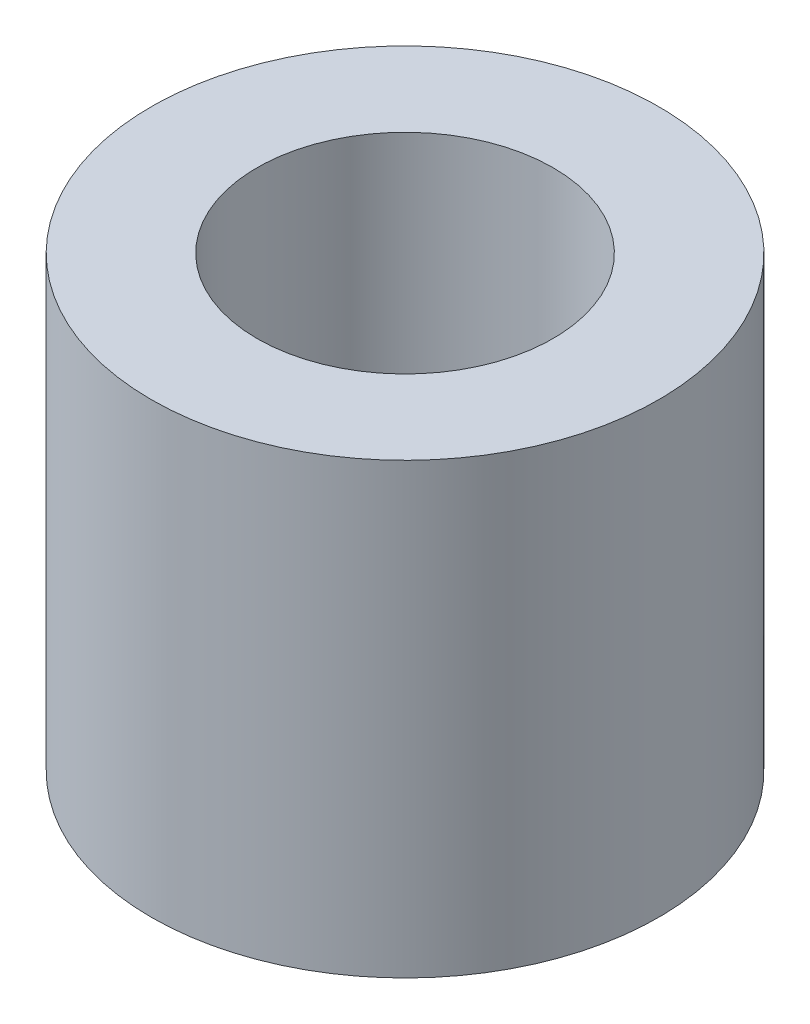
ISO-10303-21;
HEADER;
FILE_DESCRIPTION(('STEP AP214'),'2;1');
FILE_NAME('part.step','',(''),(''),'','','');
FILE_SCHEMA(('AUTOMOTIVE_DESIGN { 1 0 10303 214 1 1 1 1 }'));
ENDSEC;
DATA;
#1=APPLICATION_CONTEXT('core data for automotive mechanical design processes');
#2=APPLICATION_PROTOCOL_DEFINITION('international standard','automotive_design',2000,#1);
#3=PRODUCT_CONTEXT('',#1,'mechanical');
#4=PRODUCT('Part','Part','',(#3));
#5=PRODUCT_RELATED_PRODUCT_CATEGORY('part','',(#4));
#6=PRODUCT_DEFINITION_FORMATION('','',#4);
#7=PRODUCT_DEFINITION_CONTEXT('part definition',#1,'design');
#8=PRODUCT_DEFINITION('design','',#6,#7);
#9=PRODUCT_DEFINITION_SHAPE('','',#8);
#10=(LENGTH_UNIT() NAMED_UNIT(*) SI_UNIT(.MILLI.,.METRE.));
#11=(NAMED_UNIT(*) PLANE_ANGLE_UNIT() SI_UNIT($,.RADIAN.));
#12=(NAMED_UNIT(*) SI_UNIT($,.STERADIAN.) SOLID_ANGLE_UNIT());
#13=UNCERTAINTY_MEASURE_WITH_UNIT(LENGTH_MEASURE(1.E-05),#10,'distance_accuracy_value','');
#14=(GEOMETRIC_REPRESENTATION_CONTEXT(3) GLOBAL_UNCERTAINTY_ASSIGNED_CONTEXT((#13)) GLOBAL_UNIT_ASSIGNED_CONTEXT((#10,
#11,#12)) REPRESENTATION_CONTEXT('',''));
#15=CARTESIAN_POINT('',(0.,0.,0.));
#16=DIRECTION('',(0.,0.,1.));
#17=DIRECTION('',(1.,0.,0.));
#18=AXIS2_PLACEMENT_3D('',#15,#16,#17);
#19=CARTESIAN_POINT('',(0.,5.3,0.));
#20=DIRECTION('',(0.,1.,0.));
#21=DIRECTION('',(0.,0.,1.));
#22=AXIS2_PLACEMENT_3D('',#19,#20,#21);
#23=PLANE('',#22);
#24=CARTESIAN_POINT('',(0.,5.3,0.));
#25=DIRECTION('',(0.,1.,0.));
#26=DIRECTION('',(0.,0.,1.));
#27=AXIS2_PLACEMENT_3D('',#24,#25,#26);
#28=CIRCLE('',#27,3.);
#29=CARTESIAN_POINT('',(0.,5.3,3.));
#30=VERTEX_POINT('',#29);
#31=EDGE_CURVE('E10',#30,#30,#28,.T.);
#32=ORIENTED_EDGE('',*,*,#31,.T.);
#33=EDGE_LOOP('',(#32));
#34=FACE_BOUND('',#33,.T.);
#35=CARTESIAN_POINT('',(0.,5.3,0.));
#36=DIRECTION('',(0.,1.,0.));
#37=DIRECTION('',(0.,0.,1.));
#38=AXIS2_PLACEMENT_3D('',#35,#36,#37);
#39=CIRCLE('',#38,1.75);
#40=CARTESIAN_POINT('',(0.,5.3,1.75));
#41=VERTEX_POINT('',#40);
#42=EDGE_CURVE('E44',#41,#41,#39,.T.);
#43=ORIENTED_EDGE('',*,*,#42,.F.);
#44=EDGE_LOOP('',(#43));
#45=FACE_BOUND('',#44,.T.);
#46=ADVANCED_FACE('F33',(#34,#45),#23,.T.);
#47=CARTESIAN_POINT('',(0.,0.,0.));
#48=DIRECTION('',(0.,1.,0.));
#49=DIRECTION('',(0.,0.,1.));
#50=AXIS2_PLACEMENT_3D('',#47,#48,#49);
#51=PLANE('',#50);
#52=CARTESIAN_POINT('',(0.,0.,0.));
#53=DIRECTION('',(0.,1.,0.));
#54=DIRECTION('',(0.,0.,1.));
#55=AXIS2_PLACEMENT_3D('',#52,#53,#54);
#56=CIRCLE('',#55,3.);
#57=CARTESIAN_POINT('',(0.,0.,3.));
#58=VERTEX_POINT('',#57);
#59=EDGE_CURVE('E37',#58,#58,#56,.T.);
#60=ORIENTED_EDGE('',*,*,#59,.F.);
#61=EDGE_LOOP('',(#60));
#62=FACE_BOUND('',#61,.T.);
#63=CARTESIAN_POINT('',(0.,0.,0.));
#64=DIRECTION('',(0.,1.,0.));
#65=DIRECTION('',(0.,0.,1.));
#66=AXIS2_PLACEMENT_3D('',#63,#64,#65);
#67=CIRCLE('',#66,1.75);
#68=CARTESIAN_POINT('',(0.,0.,1.75));
#69=VERTEX_POINT('',#68);
#70=EDGE_CURVE('E46',#69,#69,#67,.T.);
#71=ORIENTED_EDGE('',*,*,#70,.T.);
#72=EDGE_LOOP('',(#71));
#73=FACE_BOUND('',#72,.T.);
#74=ADVANCED_FACE('F56',(#62,#73),#51,.F.);
#75=CARTESIAN_POINT('',(0.,5.3,0.));
#76=DIRECTION('',(0.,-1.,0.));
#77=DIRECTION('',(0.,0.,-1.));
#78=AXIS2_PLACEMENT_3D('',#75,#76,#77);
#79=CYLINDRICAL_SURFACE('',#78,3.);
#80=ORIENTED_EDGE('',*,*,#31,.F.);
#81=EDGE_LOOP('',(#80));
#82=FACE_BOUND('',#81,.T.);
#83=ORIENTED_EDGE('',*,*,#59,.T.);
#84=EDGE_LOOP('',(#83));
#85=FACE_BOUND('',#84,.T.);
#86=ADVANCED_FACE('F35',(#82,#85),#79,.T.);
#87=CARTESIAN_POINT('',(0.,5.3,0.));
#88=DIRECTION('',(0.,-1.,0.));
#89=DIRECTION('',(0.,0.,-1.));
#90=AXIS2_PLACEMENT_3D('',#87,#88,#89);
#91=CYLINDRICAL_SURFACE('',#90,1.75);
#92=ORIENTED_EDGE('',*,*,#42,.T.);
#93=EDGE_LOOP('',(#92));
#94=FACE_BOUND('',#93,.T.);
#95=ORIENTED_EDGE('',*,*,#70,.F.);
#96=EDGE_LOOP('',(#95));
#97=FACE_BOUND('',#96,.T.);
#98=ADVANCED_FACE('F52',(#94,#97),#91,.F.);
#99=CLOSED_SHELL('',(#46,#74,#86,#98));
#100=MANIFOLD_SOLID_BREP('B2',#99);
#101=ADVANCED_BREP_SHAPE_REPRESENTATION('',(#18,#100),#14);
#102=SHAPE_DEFINITION_REPRESENTATION(#9,#101);
ENDSEC;
END-ISO-10303-21;
